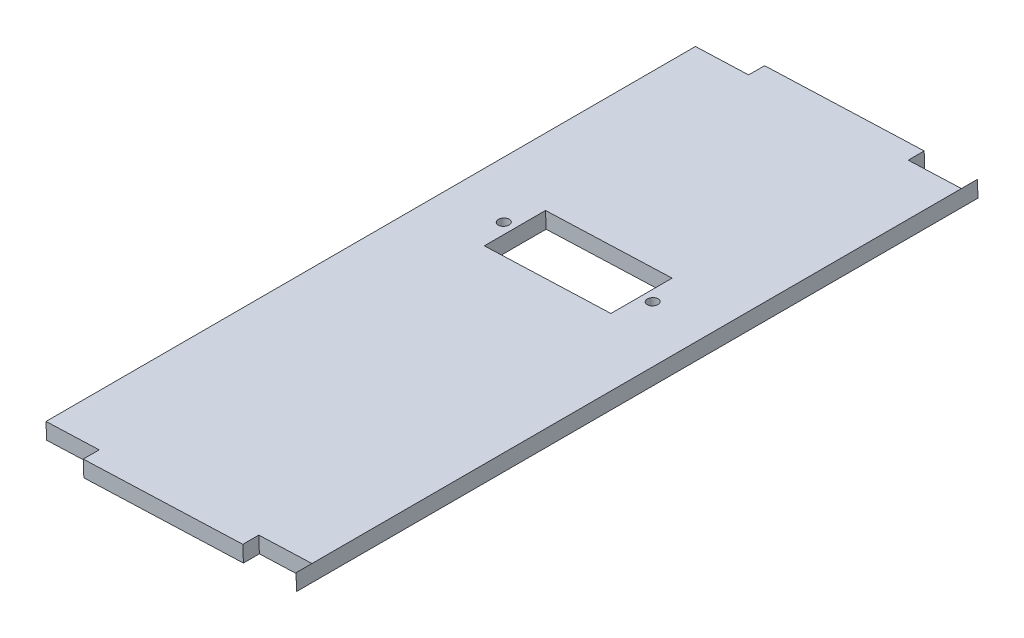
ISO-10303-21;
HEADER;
FILE_DESCRIPTION(('STEP AP214'),'2;1');
FILE_NAME('part.step','',(''),(''),'','','');
FILE_SCHEMA(('AUTOMOTIVE_DESIGN { 1 0 10303 214 1 1 1 1 }'));
ENDSEC;
DATA;
#1=APPLICATION_CONTEXT('core data for automotive mechanical design processes');
#2=APPLICATION_PROTOCOL_DEFINITION('international standard','automotive_design',2000,#1);
#3=PRODUCT_CONTEXT('',#1,'mechanical');
#4=PRODUCT('Part','Part','',(#3));
#5=PRODUCT_RELATED_PRODUCT_CATEGORY('part','',(#4));
#6=PRODUCT_DEFINITION_FORMATION('','',#4);
#7=PRODUCT_DEFINITION_CONTEXT('part definition',#1,'design');
#8=PRODUCT_DEFINITION('design','',#6,#7);
#9=PRODUCT_DEFINITION_SHAPE('','',#8);
#10=(LENGTH_UNIT() NAMED_UNIT(*) SI_UNIT(.MILLI.,.METRE.));
#11=(NAMED_UNIT(*) PLANE_ANGLE_UNIT() SI_UNIT($,.RADIAN.));
#12=(NAMED_UNIT(*) SI_UNIT($,.STERADIAN.) SOLID_ANGLE_UNIT());
#13=UNCERTAINTY_MEASURE_WITH_UNIT(LENGTH_MEASURE(1.E-05),#10,'distance_accuracy_value','');
#14=(GEOMETRIC_REPRESENTATION_CONTEXT(3) GLOBAL_UNCERTAINTY_ASSIGNED_CONTEXT((#13)) GLOBAL_UNIT_ASSIGNED_CONTEXT((#10,
#11,#12)) REPRESENTATION_CONTEXT('',''));
#15=CARTESIAN_POINT('',(0.,0.,0.));
#16=DIRECTION('',(0.,0.,1.));
#17=DIRECTION('',(1.,0.,0.));
#18=AXIS2_PLACEMENT_3D('',#15,#16,#17);
#19=CARTESIAN_POINT('',(0.,0.,890.01));
#20=DIRECTION('',(0.,0.,-1.));
#21=DIRECTION('',(-1.,0.,0.));
#22=AXIS2_PLACEMENT_3D('',#19,#20,#21);
#23=PLANE('',#22);
#24=DIRECTION('',(0.0396321778122835,-0.999214336607445,0.));
#25=VECTOR('',#24,1.);
#26=CARTESIAN_POINT('',(21.3702580239421,-5.63989004149993,890.01));
#27=LINE('',#26,#25);
#28=CARTESIAN_POINT('',(21.3702580239432,-5.63989004149989,890.01));
#29=VERTEX_POINT('',#28);
#30=CARTESIAN_POINT('',(21.4891545573789,-8.63753305132227,890.01));
#31=VERTEX_POINT('',#30);
#32=EDGE_CURVE('E254',#29,#31,#27,.T.);
#33=ORIENTED_EDGE('',*,*,#32,.F.);
#34=DIRECTION('',(0.0373407916957706,-0.999302589447027,0.));
#35=VECTOR('',#34,1.);
#36=CARTESIAN_POINT('',(21.1300096451221,0.789561937515577,890.01));
#37=LINE('',#36,#35);
#38=CARTESIAN_POINT('',(21.4822801045103,-8.63778992798335,890.01));
#39=VERTEX_POINT('',#38);
#40=EDGE_CURVE('E297',#29,#39,#37,.T.);
#41=ORIENTED_EDGE('',*,*,#40,.T.);
#42=DIRECTION('',(-0.999302589447027,-0.0373407916957706,0.));
#43=VECTOR('',#42,1.);
#44=CARTESIAN_POINT('',(21.4891545573789,-8.63753305132227,890.01));
#45=LINE('',#44,#43);
#46=EDGE_CURVE('E259',#31,#39,#45,.T.);
#47=ORIENTED_EDGE('',*,*,#46,.F.);
#48=EDGE_LOOP('',(#33,#41,#47));
#49=FACE_BOUND('',#48,.T.);
#50=ADVANCED_FACE('F41',(#49),#23,.F.);
#51=CARTESIAN_POINT('',(0.,0.,762.01));
#52=DIRECTION('',(0.,0.,-1.));
#53=DIRECTION('',(-1.,0.,0.));
#54=AXIS2_PLACEMENT_3D('',#51,#52,#53);
#55=PLANE('',#54);
#56=DIRECTION('',(0.0373407916957706,-0.999302589447027,0.));
#57=VECTOR('',#56,1.);
#58=CARTESIAN_POINT('',(21.130009645121,0.789561937515535,762.01));
#59=LINE('',#58,#57);
#60=CARTESIAN_POINT('',(21.3702580239421,-5.63989004149993,762.01));
#61=VERTEX_POINT('',#60);
#62=CARTESIAN_POINT('',(21.4822801045092,-8.63778992798339,762.01));
#63=VERTEX_POINT('',#62);
#64=EDGE_CURVE('E287',#61,#63,#59,.T.);
#65=ORIENTED_EDGE('',*,*,#64,.F.);
#66=DIRECTION('',(0.0396321778122835,-0.999214336607445,0.));
#67=VECTOR('',#66,1.);
#68=CARTESIAN_POINT('',(21.3702580239421,-5.63989004149993,762.01));
#69=LINE('',#68,#67);
#70=CARTESIAN_POINT('',(21.4891545573789,-8.63753305132227,762.01));
#71=VERTEX_POINT('',#70);
#72=EDGE_CURVE('E253',#61,#71,#69,.T.);
#73=ORIENTED_EDGE('',*,*,#72,.T.);
#74=DIRECTION('',(-0.999302589447027,-0.0373407916957706,0.));
#75=VECTOR('',#74,1.);
#76=CARTESIAN_POINT('',(21.4891545573789,-8.63753305132227,762.01));
#77=LINE('',#76,#75);
#78=EDGE_CURVE('E269',#71,#63,#77,.T.);
#79=ORIENTED_EDGE('',*,*,#78,.T.);
#80=EDGE_LOOP('',(#65,#73,#79));
#81=FACE_BOUND('',#80,.T.);
#82=ADVANCED_FACE('F401',(#81),#55,.T.);
#83=CARTESIAN_POINT('',(21.3702580239421,-5.63989004149993,890.01));
#84=DIRECTION('',(0.999214336607445,0.0396321778122835,0.));
#85=DIRECTION('',(-0.0396321778122835,0.999214336607445,0.));
#86=AXIS2_PLACEMENT_3D('',#83,#84,#85);
#87=PLANE('',#86);
#88=ORIENTED_EDGE('',*,*,#72,.F.);
#89=DIRECTION('',(0.,0.,-1.));
#90=VECTOR('',#89,1.);
#91=CARTESIAN_POINT('',(21.3702580239421,-5.63989004149993,762.01));
#92=LINE('',#91,#90);
#93=CARTESIAN_POINT('',(21.3702580239421,-5.63989004149993,765.01));
#94=VERTEX_POINT('',#93);
#95=EDGE_CURVE('E210',#94,#61,#92,.T.);
#96=ORIENTED_EDGE('',*,*,#95,.F.);
#97=DIRECTION('',(0.,0.,-1.));
#98=VECTOR('',#97,1.);
#99=CARTESIAN_POINT('',(21.3702580239421,-5.63989004149993,890.01));
#100=LINE('',#99,#98);
#101=CARTESIAN_POINT('',(21.3702580239432,-5.63989004149989,887.01));
#102=VERTEX_POINT('',#101);
#103=EDGE_CURVE('E278',#102,#94,#100,.T.);
#104=ORIENTED_EDGE('',*,*,#103,.F.);
#105=EDGE_CURVE('E274',#29,#102,#100,.T.);
#106=ORIENTED_EDGE('',*,*,#105,.F.);
#107=ORIENTED_EDGE('',*,*,#32,.T.);
#108=DIRECTION('',(0.,0.,-1.));
#109=VECTOR('',#108,1.);
#110=CARTESIAN_POINT('',(21.4891545573789,-8.63753305132227,890.01));
#111=LINE('',#110,#109);
#112=EDGE_CURVE('E265',#31,#71,#111,.T.);
#113=ORIENTED_EDGE('',*,*,#112,.T.);
#114=EDGE_LOOP('',(#88,#96,#104,#106,#107,#113));
#115=FACE_BOUND('',#114,.T.);
#116=ADVANCED_FACE('F43',(#115),#87,.T.);
#117=CARTESIAN_POINT('',(21.3702580239421,-5.63989004149993,890.01));
#118=DIRECTION('',(-0.0373407916957706,0.999302589447027,0.));
#119=DIRECTION('',(-0.999302589447027,-0.0373407916957706,0.));
#120=AXIS2_PLACEMENT_3D('',#117,#118,#119);
#121=PLANE('',#120);
#122=CARTESIAN_POINT('',(-17.602542964492,-7.09618091763499,812.01));
#123=DIRECTION('',(-0.0373407916957706,0.999302589447027,0.));
#124=DIRECTION('',(0.999302589447027,0.0373407916957706,0.));
#125=AXIS2_PLACEMENT_3D('',#122,#123,#124);
#126=CIRCLE('',#125,1.00000000000001);
#127=CARTESIAN_POINT('',(-16.6032403750449,-7.05884012593921,812.01));
#128=VERTEX_POINT('',#127);
#129=EDGE_CURVE('E460',#128,#128,#126,.T.);
#130=ORIENTED_EDGE('',*,*,#129,.F.);
#131=EDGE_LOOP('',(#130));
#132=FACE_BOUND('',#131,.T.);
#133=CARTESIAN_POINT('',(10.3779295400248,-6.05063875015341,812.01));
#134=DIRECTION('',(-0.0373407916957706,0.999302589447027,0.));
#135=DIRECTION('',(-0.999302589447027,-0.0373407916957706,0.));
#136=AXIS2_PLACEMENT_3D('',#133,#134,#135);
#137=CIRCLE('',#136,1.);
#138=CARTESIAN_POINT('',(9.37862695057775,-6.08797954184918,812.01));
#139=VERTEX_POINT('',#138);
#140=EDGE_CURVE('E458',#139,#139,#137,.T.);
#141=ORIENTED_EDGE('',*,*,#140,.F.);
#142=EDGE_LOOP('',(#141));
#143=FACE_BOUND('',#142,.T.);
#144=DIRECTION('',(0.,0.,-1.));
#145=VECTOR('',#144,1.);
#146=CARTESIAN_POINT('',(8.27939410218603,-6.12905441271453,806.26));
#147=LINE('',#146,#145);
#148=CARTESIAN_POINT('',(8.27939410218603,-6.12905441271453,817.76));
#149=VERTEX_POINT('',#148);
#150=CARTESIAN_POINT('',(8.27939410218601,-6.12905441271453,806.26));
#151=VERTEX_POINT('',#150);
#152=EDGE_CURVE('E58',#149,#151,#147,.T.);
#153=ORIENTED_EDGE('',*,*,#152,.F.);
#154=DIRECTION('',(0.999302589447027,0.0373407916957706,0.));
#155=VECTOR('',#154,1.);
#156=CARTESIAN_POINT('',(-15.5040075266532,-7.01776525507387,817.76));
#157=LINE('',#156,#155);
#158=CARTESIAN_POINT('',(-15.5040075266532,-7.01776525507387,817.76));
#159=VERTEX_POINT('',#158);
#160=EDGE_CURVE('E192',#159,#149,#157,.T.);
#161=ORIENTED_EDGE('',*,*,#160,.F.);
#162=DIRECTION('',(0.,0.,1.));
#163=VECTOR('',#162,1.);
#164=CARTESIAN_POINT('',(-15.5040075266532,-7.01776525507387,806.26));
#165=LINE('',#164,#163);
#166=CARTESIAN_POINT('',(-15.5040075266532,-7.01776525507387,806.26));
#167=VERTEX_POINT('',#166);
#168=EDGE_CURVE('E176',#167,#159,#165,.T.);
#169=ORIENTED_EDGE('',*,*,#168,.F.);
#170=DIRECTION('',(-0.999302589447027,-0.0373407916957706,0.));
#171=VECTOR('',#170,1.);
#172=CARTESIAN_POINT('',(-15.5040075266532,-7.01776525507387,806.26));
#173=LINE('',#172,#171);
#174=EDGE_CURVE('E185',#151,#167,#173,.T.);
#175=ORIENTED_EDGE('',*,*,#174,.F.);
#176=EDGE_LOOP('',(#153,#161,#169,#175));
#177=FACE_BOUND('',#176,.T.);
#178=DIRECTION('',(0.,0.,1.));
#179=VECTOR('',#178,1.);
#180=CARTESIAN_POINT('',(11.3772058565452,-6.01329894019419,887.01));
#181=LINE('',#180,#179);
#182=CARTESIAN_POINT('',(11.3772058565452,-6.01329894019419,887.01));
#183=VERTEX_POINT('',#182);
#184=CARTESIAN_POINT('',(11.3772058565452,-6.01329894019419,890.01));
#185=VERTEX_POINT('',#184);
#186=EDGE_CURVE('E220',#183,#185,#181,.T.);
#187=ORIENTED_EDGE('',*,*,#186,.F.);
#188=DIRECTION('',(-0.999302589447027,-0.0373407916957706,0.));
#189=VECTOR('',#188,1.);
#190=CARTESIAN_POINT('',(21.3702580239432,-5.63989004149989,887.01));
#191=LINE('',#190,#189);
#192=EDGE_CURVE('E214',#102,#183,#191,.T.);
#193=ORIENTED_EDGE('',*,*,#192,.F.);
#194=ORIENTED_EDGE('',*,*,#103,.T.);
#195=DIRECTION('',(0.999302589447027,0.0373407916957706,0.));
#196=VECTOR('',#195,1.);
#197=CARTESIAN_POINT('',(21.3702580239421,-5.63989004149993,765.01));
#198=LINE('',#197,#196);
#199=CARTESIAN_POINT('',(11.3772058565441,-6.01329894019423,765.01));
#200=VERTEX_POINT('',#199);
#201=EDGE_CURVE('E230',#200,#94,#198,.T.);
#202=ORIENTED_EDGE('',*,*,#201,.F.);
#203=DIRECTION('',(0.,0.,1.));
#204=VECTOR('',#203,1.);
#205=CARTESIAN_POINT('',(11.3772058565441,-6.01329894019423,762.01));
#206=LINE('',#205,#204);
#207=CARTESIAN_POINT('',(11.3772058565441,-6.01329894019423,762.01));
#208=VERTEX_POINT('',#207);
#209=EDGE_CURVE('E227',#208,#200,#206,.T.);
#210=ORIENTED_EDGE('',*,*,#209,.F.);
#211=DIRECTION('',(0.999302589447027,0.0373407916957706,0.));
#212=VECTOR('',#211,1.);
#213=CARTESIAN_POINT('',(21.3702580239421,-5.63989004149993,762.01));
#214=LINE('',#213,#212);
#215=CARTESIAN_POINT('',(-18.601845553939,-7.13352170933075,762.01));
#216=VERTEX_POINT('',#215);
#217=EDGE_CURVE('E258',#216,#208,#214,.T.);
#218=ORIENTED_EDGE('',*,*,#217,.F.);
#219=DIRECTION('',(0.,0.,-1.));
#220=VECTOR('',#219,1.);
#221=CARTESIAN_POINT('',(-18.601845553939,-7.13352170933076,762.01));
#222=LINE('',#221,#220);
#223=CARTESIAN_POINT('',(-18.601845553939,-7.13352170933076,765.01));
#224=VERTEX_POINT('',#223);
#225=EDGE_CURVE('E208',#224,#216,#222,.T.);
#226=ORIENTED_EDGE('',*,*,#225,.F.);
#227=DIRECTION('',(0.999302589447027,0.0373407916957707,0.));
#228=VECTOR('',#227,1.);
#229=CARTESIAN_POINT('',(-18.601845553939,-7.13352170933076,765.01));
#230=LINE('',#229,#228);
#231=CARTESIAN_POINT('',(-28.5948714484093,-7.50692962628846,765.01));
#232=VERTEX_POINT('',#231);
#233=EDGE_CURVE('E204',#232,#224,#230,.T.);
#234=ORIENTED_EDGE('',*,*,#233,.F.);
#235=DIRECTION('',(0.,0.,-1.));
#236=VECTOR('',#235,1.);
#237=CARTESIAN_POINT('',(-28.5948714484093,-7.50692962628846,890.01));
#238=LINE('',#237,#236);
#239=CARTESIAN_POINT('',(-28.5948714484093,-7.50692962628846,887.01));
#240=VERTEX_POINT('',#239);
#241=EDGE_CURVE('E279',#240,#232,#238,.T.);
#242=ORIENTED_EDGE('',*,*,#241,.F.);
#243=DIRECTION('',(-0.999302589447027,-0.0373407916957707,0.));
#244=VECTOR('',#243,1.);
#245=CARTESIAN_POINT('',(-18.6018455539379,-7.13352170933071,887.01));
#246=LINE('',#245,#244);
#247=CARTESIAN_POINT('',(-18.6018455539379,-7.13352170933071,887.01));
#248=VERTEX_POINT('',#247);
#249=EDGE_CURVE('E213',#248,#240,#246,.T.);
#250=ORIENTED_EDGE('',*,*,#249,.F.);
#251=DIRECTION('',(0.,0.,-1.));
#252=VECTOR('',#251,1.);
#253=CARTESIAN_POINT('',(-18.6018455539379,-7.13352170933071,887.01));
#254=LINE('',#253,#252);
#255=CARTESIAN_POINT('',(-18.6018455539379,-7.13352170933071,890.01));
#256=VERTEX_POINT('',#255);
#257=EDGE_CURVE('E205',#256,#248,#254,.T.);
#258=ORIENTED_EDGE('',*,*,#257,.F.);
#259=DIRECTION('',(0.999302589447027,0.0373407916957706,0.));
#260=VECTOR('',#259,1.);
#261=CARTESIAN_POINT('',(21.3702580239421,-5.63989004149993,890.01));
#262=LINE('',#261,#260);
#263=EDGE_CURVE('E262',#256,#185,#262,.T.);
#264=ORIENTED_EDGE('',*,*,#263,.T.);
#265=EDGE_LOOP('',(#187,#193,#194,#202,#210,#218,#226,#234,#242,#250,#258,#264));
#266=FACE_BOUND('',#265,.T.);
#267=ADVANCED_FACE('F189',(#132,#143,#177,#266),#121,.T.);
#268=CARTESIAN_POINT('',(-28.5948714484093,-7.50692962628846,890.01));
#269=DIRECTION('',(-0.999214336607445,-0.0396321778122847,0.));
#270=DIRECTION('',(0.0396321778122847,-0.999214336607445,0.));
#271=AXIS2_PLACEMENT_3D('',#268,#269,#270);
#272=PLANE('',#271);
#273=DIRECTION('',(0.0396321778122847,-0.999214336607445,0.));
#274=VECTOR('',#273,1.);
#275=CARTESIAN_POINT('',(-28.5948714484093,-7.50692962628846,887.01));
#276=LINE('',#275,#274);
#277=CARTESIAN_POINT('',(-28.4759749149724,-10.5045726361108,887.01));
#278=VERTEX_POINT('',#277);
#279=EDGE_CURVE('E251',#240,#278,#276,.T.);
#280=ORIENTED_EDGE('',*,*,#279,.F.);
#281=ORIENTED_EDGE('',*,*,#241,.T.);
#282=DIRECTION('',(-0.0396321778122847,0.999214336607445,0.));
#283=VECTOR('',#282,1.);
#284=CARTESIAN_POINT('',(-28.5948714484093,-7.50692962628846,765.01));
#285=LINE('',#284,#283);
#286=CARTESIAN_POINT('',(-28.4759749149724,-10.5045726361108,765.01));
#287=VERTEX_POINT('',#286);
#288=EDGE_CURVE('E249',#287,#232,#285,.T.);
#289=ORIENTED_EDGE('',*,*,#288,.F.);
#290=DIRECTION('',(0.,0.,-1.));
#291=VECTOR('',#290,1.);
#292=CARTESIAN_POINT('',(-28.4759749149724,-10.5045726361108,890.01));
#293=LINE('',#292,#291);
#294=EDGE_CURVE('E282',#278,#287,#293,.T.);
#295=ORIENTED_EDGE('',*,*,#294,.F.);
#296=EDGE_LOOP('',(#280,#281,#289,#295));
#297=FACE_BOUND('',#296,.T.);
#298=ADVANCED_FACE('F324',(#297),#272,.T.);
#299=CARTESIAN_POINT('',(21.4891545573789,-8.63753305132227,890.01));
#300=DIRECTION('',(0.0373407916957706,-0.999302589447027,0.));
#301=DIRECTION('',(0.999302589447027,0.0373407916957706,0.));
#302=AXIS2_PLACEMENT_3D('',#299,#300,#301);
#303=PLANE('',#302);
#304=CARTESIAN_POINT('',(-17.4905208839249,-10.0940808041184,812.01));
#305=DIRECTION('',(0.0373407916957706,-0.999302589447027,0.));
#306=DIRECTION('',(0.999302589447027,0.0373407916957706,0.));
#307=AXIS2_PLACEMENT_3D('',#304,#305,#306);
#308=CIRCLE('',#307,1.00000000000001);
#309=CARTESIAN_POINT('',(-16.4912182944778,-10.0567400124227,812.01));
#310=VERTEX_POINT('',#309);
#311=EDGE_CURVE('E45',#310,#310,#308,.T.);
#312=ORIENTED_EDGE('',*,*,#311,.F.);
#313=EDGE_LOOP('',(#312));
#314=FACE_BOUND('',#313,.T.);
#315=CARTESIAN_POINT('',(10.4899516205919,-9.04853863663687,812.01));
#316=DIRECTION('',(0.0373407916957706,-0.999302589447027,0.));
#317=DIRECTION('',(0.999302589447027,0.0373407916957706,0.));
#318=AXIS2_PLACEMENT_3D('',#315,#316,#317);
#319=CIRCLE('',#318,1.);
#320=CARTESIAN_POINT('',(11.4892542100389,-9.0111978449411,812.01));
#321=VERTEX_POINT('',#320);
#322=EDGE_CURVE('E199',#321,#321,#319,.T.);
#323=ORIENTED_EDGE('',*,*,#322,.F.);
#324=EDGE_LOOP('',(#323));
#325=FACE_BOUND('',#324,.T.);
#326=DIRECTION('',(0.,0.,1.));
#327=VECTOR('',#326,1.);
#328=CARTESIAN_POINT('',(8.39141618275315,-9.12695429919799,890.01));
#329=LINE('',#328,#327);
#330=CARTESIAN_POINT('',(8.39141618275313,-9.12695429919799,806.26));
#331=VERTEX_POINT('',#330);
#332=CARTESIAN_POINT('',(8.39141618275313,-9.12695429919799,817.76));
#333=VERTEX_POINT('',#332);
#334=EDGE_CURVE('E11',#331,#333,#329,.T.);
#335=ORIENTED_EDGE('',*,*,#334,.F.);
#336=DIRECTION('',(0.999302589447027,0.0373407916957706,0.));
#337=VECTOR('',#336,1.);
#338=CARTESIAN_POINT('',(21.4891545573789,-8.63753305132227,806.26));
#339=LINE('',#338,#337);
#340=CARTESIAN_POINT('',(-15.3919854460861,-10.0156651415573,806.26));
#341=VERTEX_POINT('',#340);
#342=EDGE_CURVE('E308',#341,#331,#339,.T.);
#343=ORIENTED_EDGE('',*,*,#342,.F.);
#344=DIRECTION('',(0.,0.,-1.));
#345=VECTOR('',#344,1.);
#346=CARTESIAN_POINT('',(-15.3919854460861,-10.0156651415573,890.01));
#347=LINE('',#346,#345);
#348=CARTESIAN_POINT('',(-15.3919854460861,-10.0156651415573,817.76));
#349=VERTEX_POINT('',#348);
#350=EDGE_CURVE('E179',#349,#341,#347,.T.);
#351=ORIENTED_EDGE('',*,*,#350,.F.);
#352=DIRECTION('',(-0.999302589447027,-0.0373407916957706,0.));
#353=VECTOR('',#352,1.);
#354=CARTESIAN_POINT('',(21.4891545573789,-8.63753305132227,817.76));
#355=LINE('',#354,#353);
#356=EDGE_CURVE('E50',#333,#349,#355,.T.);
#357=ORIENTED_EDGE('',*,*,#356,.F.);
#358=EDGE_LOOP('',(#335,#343,#351,#357));
#359=FACE_BOUND('',#358,.T.);
#360=DIRECTION('',(0.,0.,1.));
#361=VECTOR('',#360,1.);
#362=CARTESIAN_POINT('',(21.4822801045103,-8.63778992798335,890.01));
#363=LINE('',#362,#361);
#364=CARTESIAN_POINT('',(21.4822801045103,-8.63778992798335,887.01));
#365=VERTEX_POINT('',#364);
#366=EDGE_CURVE('E247',#365,#39,#363,.T.);
#367=ORIENTED_EDGE('',*,*,#366,.F.);
#368=DIRECTION('',(0.999302589447027,0.0373407916957706,0.));
#369=VECTOR('',#368,1.);
#370=CARTESIAN_POINT('',(21.4891545573789,-8.63753305132227,887.01));
#371=LINE('',#370,#369);
#372=CARTESIAN_POINT('',(11.4892279371123,-9.01119882667765,887.01));
#373=VERTEX_POINT('',#372);
#374=EDGE_CURVE('E306',#373,#365,#371,.T.);
#375=ORIENTED_EDGE('',*,*,#374,.F.);
#376=DIRECTION('',(0.,0.,-1.));
#377=VECTOR('',#376,1.);
#378=CARTESIAN_POINT('',(11.4892279371123,-9.01119882667765,890.01));
#379=LINE('',#378,#377);
#380=CARTESIAN_POINT('',(11.4892279371123,-9.01119882667765,890.01));
#381=VERTEX_POINT('',#380);
#382=EDGE_CURVE('E245',#381,#373,#379,.T.);
#383=ORIENTED_EDGE('',*,*,#382,.F.);
#384=CARTESIAN_POINT('',(-18.4898234733708,-10.1314215958142,890.01));
#385=VERTEX_POINT('',#384);
#386=EDGE_CURVE('E257',#381,#385,#45,.T.);
#387=ORIENTED_EDGE('',*,*,#386,.T.);
#388=DIRECTION('',(0.,0.,1.));
#389=VECTOR('',#388,1.);
#390=CARTESIAN_POINT('',(-18.4898234733708,-10.1314215958142,890.01));
#391=LINE('',#390,#389);
#392=CARTESIAN_POINT('',(-18.4898234733708,-10.1314215958142,887.01));
#393=VERTEX_POINT('',#392);
#394=EDGE_CURVE('E243',#393,#385,#391,.T.);
#395=ORIENTED_EDGE('',*,*,#394,.F.);
#396=DIRECTION('',(0.999302589447027,0.0373407916957706,0.));
#397=VECTOR('',#396,1.);
#398=CARTESIAN_POINT('',(21.4891545573789,-8.63753305132227,887.01));
#399=LINE('',#398,#397);
#400=EDGE_CURVE('E304',#278,#393,#399,.T.);
#401=ORIENTED_EDGE('',*,*,#400,.F.);
#402=ORIENTED_EDGE('',*,*,#294,.T.);
#403=DIRECTION('',(-0.999302589447027,-0.0373407916957706,0.));
#404=VECTOR('',#403,1.);
#405=CARTESIAN_POINT('',(21.4891545573789,-8.63753305132227,765.01));
#406=LINE('',#405,#404);
#407=CARTESIAN_POINT('',(-18.4898234733719,-10.1314215958142,765.01));
#408=VERTEX_POINT('',#407);
#409=EDGE_CURVE('E302',#408,#287,#406,.T.);
#410=ORIENTED_EDGE('',*,*,#409,.F.);
#411=DIRECTION('',(0.,0.,1.));
#412=VECTOR('',#411,1.);
#413=CARTESIAN_POINT('',(-18.4898234733719,-10.1314215958142,890.01));
#414=LINE('',#413,#412);
#415=CARTESIAN_POINT('',(-18.4898234733719,-10.1314215958142,762.01));
#416=VERTEX_POINT('',#415);
#417=EDGE_CURVE('E241',#416,#408,#414,.T.);
#418=ORIENTED_EDGE('',*,*,#417,.F.);
#419=CARTESIAN_POINT('',(11.4892279371112,-9.01119882667769,762.01));
#420=VERTEX_POINT('',#419);
#421=EDGE_CURVE('E268',#420,#416,#77,.T.);
#422=ORIENTED_EDGE('',*,*,#421,.F.);
#423=DIRECTION('',(0.,0.,-1.));
#424=VECTOR('',#423,1.);
#425=CARTESIAN_POINT('',(11.4892279371112,-9.01119882667769,890.01));
#426=LINE('',#425,#424);
#427=CARTESIAN_POINT('',(11.4892279371112,-9.01119882667769,765.01));
#428=VERTEX_POINT('',#427);
#429=EDGE_CURVE('E236',#428,#420,#426,.T.);
#430=ORIENTED_EDGE('',*,*,#429,.F.);
#431=DIRECTION('',(-0.999302589447027,-0.0373407916957706,0.));
#432=VECTOR('',#431,1.);
#433=CARTESIAN_POINT('',(21.4891545573789,-8.63753305132227,765.01));
#434=LINE('',#433,#432);
#435=CARTESIAN_POINT('',(21.4822801045092,-8.63778992798339,765.01));
#436=VERTEX_POINT('',#435);
#437=EDGE_CURVE('E300',#436,#428,#434,.T.);
#438=ORIENTED_EDGE('',*,*,#437,.F.);
#439=DIRECTION('',(0.,0.,1.));
#440=VECTOR('',#439,1.);
#441=CARTESIAN_POINT('',(21.4822801045092,-8.63778992798339,890.01));
#442=LINE('',#441,#440);
#443=EDGE_CURVE('E239',#63,#436,#442,.T.);
#444=ORIENTED_EDGE('',*,*,#443,.F.);
#445=ORIENTED_EDGE('',*,*,#78,.F.);
#446=ORIENTED_EDGE('',*,*,#112,.F.);
#447=ORIENTED_EDGE('',*,*,#46,.T.);
#448=EDGE_LOOP('',(#367,#375,#383,#387,#395,#401,#402,#410,#418,#422,#430,#438,#444,#445,#446,#447));
#449=FACE_BOUND('',#448,.T.);
#450=ADVANCED_FACE('F320',(#314,#325,#359,#449),#303,.T.);
#451=ORIENTED_EDGE('',*,*,#386,.F.);
#452=DIRECTION('',(-0.0373407916957706,0.999302589447027,0.));
#453=VECTOR('',#452,1.);
#454=CARTESIAN_POINT('',(11.1369574777241,0.416153038821275,890.01));
#455=LINE('',#454,#453);
#456=EDGE_CURVE('E294',#381,#185,#455,.T.);
#457=ORIENTED_EDGE('',*,*,#456,.T.);
#458=ORIENTED_EDGE('',*,*,#263,.F.);
#459=DIRECTION('',(0.0373407916957706,-0.999302589447027,0.));
#460=VECTOR('',#459,1.);
#461=CARTESIAN_POINT('',(-18.842093932759,-0.704069730315247,890.01));
#462=LINE('',#461,#460);
#463=EDGE_CURVE('E291',#256,#385,#462,.T.);
#464=ORIENTED_EDGE('',*,*,#463,.T.);
#465=EDGE_LOOP('',(#451,#457,#458,#464));
#466=FACE_BOUND('',#465,.T.);
#467=ADVANCED_FACE('F323',(#466),#23,.F.);
#468=DIRECTION('',(0.0373407916957706,-0.999302589447027,0.));
#469=VECTOR('',#468,1.);
#470=CARTESIAN_POINT('',(-18.8420939327601,-0.704069730315288,762.01));
#471=LINE('',#470,#469);
#472=EDGE_CURVE('E289',#216,#416,#471,.T.);
#473=ORIENTED_EDGE('',*,*,#472,.F.);
#474=ORIENTED_EDGE('',*,*,#217,.T.);
#475=DIRECTION('',(-0.0373407916957706,0.999302589447027,0.));
#476=VECTOR('',#475,1.);
#477=CARTESIAN_POINT('',(11.136957477723,0.416153038821233,762.01));
#478=LINE('',#477,#476);
#479=EDGE_CURVE('E277',#420,#208,#478,.T.);
#480=ORIENTED_EDGE('',*,*,#479,.F.);
#481=ORIENTED_EDGE('',*,*,#421,.T.);
#482=EDGE_LOOP('',(#473,#474,#480,#481));
#483=FACE_BOUND('',#482,.T.);
#484=ADVANCED_FACE('F385',(#483),#55,.T.);
#485=CARTESIAN_POINT('',(21.551948219545,-10.5022262346469,762.01));
#486=DIRECTION('',(0.999302589447027,0.0373407916957706,0.));
#487=DIRECTION('',(-0.0373407916957706,0.999302589447027,0.));
#488=AXIS2_PLACEMENT_3D('',#485,#486,#487);
#489=PLANE('',#488);
#490=ORIENTED_EDGE('',*,*,#443,.T.);
#491=DIRECTION('',(-0.0373407916957706,0.999302589447027,0.));
#492=VECTOR('',#491,1.);
#493=CARTESIAN_POINT('',(21.551948219545,-10.5022262346469,765.01));
#494=LINE('',#493,#492);
#495=EDGE_CURVE('E234',#436,#94,#494,.T.);
#496=ORIENTED_EDGE('',*,*,#495,.T.);
#497=ORIENTED_EDGE('',*,*,#95,.T.);
#498=ORIENTED_EDGE('',*,*,#64,.T.);
#499=EDGE_LOOP('',(#490,#496,#497,#498));
#500=FACE_BOUND('',#499,.T.);
#501=ADVANCED_FACE('F398',(#500),#489,.F.);
#502=CARTESIAN_POINT('',(21.551948219545,-10.5022262346469,765.01));
#503=DIRECTION('',(0.,0.,1.));
#504=DIRECTION('',(1.,0.,0.));
#505=AXIS2_PLACEMENT_3D('',#502,#503,#504);
#506=PLANE('',#505);
#507=ORIENTED_EDGE('',*,*,#437,.T.);
#508=DIRECTION('',(-0.0373407916957706,0.999302589447027,0.));
#509=VECTOR('',#508,1.);
#510=CARTESIAN_POINT('',(11.5588960521469,-10.8756351333412,765.01));
#511=LINE('',#510,#509);
#512=EDGE_CURVE('E233',#428,#200,#511,.T.);
#513=ORIENTED_EDGE('',*,*,#512,.T.);
#514=ORIENTED_EDGE('',*,*,#201,.T.);
#515=ORIENTED_EDGE('',*,*,#495,.F.);
#516=EDGE_LOOP('',(#507,#513,#514,#515));
#517=FACE_BOUND('',#516,.T.);
#518=ADVANCED_FACE('F396',(#517),#506,.F.);
#519=CARTESIAN_POINT('',(11.5588960521469,-10.8756351333412,762.01));
#520=DIRECTION('',(-0.999302589447027,-0.0373407916957706,0.));
#521=DIRECTION('',(0.0373407916957706,-0.999302589447027,0.));
#522=AXIS2_PLACEMENT_3D('',#519,#520,#521);
#523=PLANE('',#522);
#524=ORIENTED_EDGE('',*,*,#429,.T.);
#525=ORIENTED_EDGE('',*,*,#479,.T.);
#526=ORIENTED_EDGE('',*,*,#209,.T.);
#527=ORIENTED_EDGE('',*,*,#512,.F.);
#528=EDGE_LOOP('',(#524,#525,#526,#527));
#529=FACE_BOUND('',#528,.T.);
#530=ADVANCED_FACE('F390',(#529),#523,.F.);
#531=CARTESIAN_POINT('',(-18.4201553583361,-11.9958579024777,762.01));
#532=DIRECTION('',(0.999302589447027,0.0373407916957706,0.));
#533=DIRECTION('',(-0.0373407916957706,0.999302589447027,0.));
#534=AXIS2_PLACEMENT_3D('',#531,#532,#533);
#535=PLANE('',#534);
#536=ORIENTED_EDGE('',*,*,#417,.T.);
#537=DIRECTION('',(-0.0373407916957706,0.999302589447027,0.));
#538=VECTOR('',#537,1.);
#539=CARTESIAN_POINT('',(-18.4201553583361,-11.9958579024777,765.01));
#540=LINE('',#539,#538);
#541=EDGE_CURVE('E202',#408,#224,#540,.T.);
#542=ORIENTED_EDGE('',*,*,#541,.T.);
#543=ORIENTED_EDGE('',*,*,#225,.T.);
#544=ORIENTED_EDGE('',*,*,#472,.T.);
#545=EDGE_LOOP('',(#536,#542,#543,#544));
#546=FACE_BOUND('',#545,.T.);
#547=ADVANCED_FACE('F381',(#546),#535,.F.);
#548=CARTESIAN_POINT('',(-18.4201553583361,-11.9958579024777,765.01));
#549=DIRECTION('',(0.,0.,1.));
#550=DIRECTION('',(1.,0.,0.));
#551=AXIS2_PLACEMENT_3D('',#548,#549,#550);
#552=PLANE('',#551);
#553=ORIENTED_EDGE('',*,*,#288,.T.);
#554=ORIENTED_EDGE('',*,*,#233,.T.);
#555=ORIENTED_EDGE('',*,*,#541,.F.);
#556=ORIENTED_EDGE('',*,*,#409,.T.);
#557=EDGE_LOOP('',(#553,#554,#555,#556));
#558=FACE_BOUND('',#557,.T.);
#559=ADVANCED_FACE('F378',(#558),#552,.F.);
#560=CARTESIAN_POINT('',(-18.420155358335,-11.9958579024777,887.01));
#561=DIRECTION('',(0.999302589447027,0.0373407916957706,0.));
#562=DIRECTION('',(-0.0373407916957706,0.999302589447027,0.));
#563=AXIS2_PLACEMENT_3D('',#560,#561,#562);
#564=PLANE('',#563);
#565=ORIENTED_EDGE('',*,*,#394,.T.);
#566=ORIENTED_EDGE('',*,*,#463,.F.);
#567=ORIENTED_EDGE('',*,*,#257,.T.);
#568=DIRECTION('',(-0.0373407916957706,0.999302589447027,0.));
#569=VECTOR('',#568,1.);
#570=CARTESIAN_POINT('',(-18.420155358335,-11.9958579024777,887.01));
#571=LINE('',#570,#569);
#572=EDGE_CURVE('E211',#393,#248,#571,.T.);
#573=ORIENTED_EDGE('',*,*,#572,.F.);
#574=EDGE_LOOP('',(#565,#566,#567,#573));
#575=FACE_BOUND('',#574,.T.);
#576=ADVANCED_FACE('F360',(#575),#564,.F.);
#577=CARTESIAN_POINT('',(-18.420155358335,-11.9958579024777,887.01));
#578=DIRECTION('',(0.,0.,-1.));
#579=DIRECTION('',(-1.,0.,0.));
#580=AXIS2_PLACEMENT_3D('',#577,#578,#579);
#581=PLANE('',#580);
#582=ORIENTED_EDGE('',*,*,#279,.T.);
#583=ORIENTED_EDGE('',*,*,#400,.T.);
#584=ORIENTED_EDGE('',*,*,#572,.T.);
#585=ORIENTED_EDGE('',*,*,#249,.T.);
#586=EDGE_LOOP('',(#582,#583,#584,#585));
#587=FACE_BOUND('',#586,.T.);
#588=ADVANCED_FACE('F367',(#587),#581,.F.);
#589=CARTESIAN_POINT('',(21.5519482195461,-10.5022262346469,887.01));
#590=DIRECTION('',(0.999302589447027,0.0373407916957706,0.));
#591=DIRECTION('',(-0.0373407916957706,0.999302589447027,0.));
#592=AXIS2_PLACEMENT_3D('',#589,#590,#591);
#593=PLANE('',#592);
#594=ORIENTED_EDGE('',*,*,#366,.T.);
#595=ORIENTED_EDGE('',*,*,#40,.F.);
#596=ORIENTED_EDGE('',*,*,#105,.T.);
#597=DIRECTION('',(-0.0373407916957706,0.999302589447027,0.));
#598=VECTOR('',#597,1.);
#599=CARTESIAN_POINT('',(21.5519482195461,-10.5022262346469,887.01));
#600=LINE('',#599,#598);
#601=EDGE_CURVE('E218',#365,#102,#600,.T.);
#602=ORIENTED_EDGE('',*,*,#601,.F.);
#603=EDGE_LOOP('',(#594,#595,#596,#602));
#604=FACE_BOUND('',#603,.T.);
#605=ADVANCED_FACE('F335',(#604),#593,.F.);
#606=CARTESIAN_POINT('',(11.5588960521481,-10.8756351333412,887.01));
#607=DIRECTION('',(-0.999302589447027,-0.0373407916957706,0.));
#608=DIRECTION('',(0.0373407916957706,-0.999302589447027,0.));
#609=AXIS2_PLACEMENT_3D('',#606,#607,#608);
#610=PLANE('',#609);
#611=ORIENTED_EDGE('',*,*,#382,.T.);
#612=DIRECTION('',(-0.0373407916957706,0.999302589447027,0.));
#613=VECTOR('',#612,1.);
#614=CARTESIAN_POINT('',(11.5588960521481,-10.8756351333412,887.01));
#615=LINE('',#614,#613);
#616=EDGE_CURVE('E221',#373,#183,#615,.T.);
#617=ORIENTED_EDGE('',*,*,#616,.T.);
#618=ORIENTED_EDGE('',*,*,#186,.T.);
#619=ORIENTED_EDGE('',*,*,#456,.F.);
#620=EDGE_LOOP('',(#611,#617,#618,#619));
#621=FACE_BOUND('',#620,.T.);
#622=ADVANCED_FACE('F352',(#621),#610,.F.);
#623=CARTESIAN_POINT('',(21.5519482195461,-10.5022262346469,887.01));
#624=DIRECTION('',(0.,0.,-1.));
#625=DIRECTION('',(-1.,0.,0.));
#626=AXIS2_PLACEMENT_3D('',#623,#624,#625);
#627=PLANE('',#626);
#628=ORIENTED_EDGE('',*,*,#374,.T.);
#629=ORIENTED_EDGE('',*,*,#601,.T.);
#630=ORIENTED_EDGE('',*,*,#192,.T.);
#631=ORIENTED_EDGE('',*,*,#616,.F.);
#632=EDGE_LOOP('',(#628,#629,#630,#631));
#633=FACE_BOUND('',#632,.T.);
#634=ADVANCED_FACE('F350',(#633),#627,.F.);
#635=CARTESIAN_POINT('',(8.46108429778892,-10.9913906058615,806.26));
#636=DIRECTION('',(0.999302589447027,0.0373407916957706,0.));
#637=DIRECTION('',(-0.0373407916957706,0.999302589447027,0.));
#638=AXIS2_PLACEMENT_3D('',#635,#636,#637);
#639=PLANE('',#638);
#640=ORIENTED_EDGE('',*,*,#334,.T.);
#641=DIRECTION('',(-0.0373407916957706,0.999302589447027,0.));
#642=VECTOR('',#641,1.);
#643=CARTESIAN_POINT('',(8.46108429778892,-10.9913906058615,817.76));
#644=LINE('',#643,#642);
#645=EDGE_CURVE('E197',#333,#149,#644,.T.);
#646=ORIENTED_EDGE('',*,*,#645,.T.);
#647=ORIENTED_EDGE('',*,*,#152,.T.);
#648=DIRECTION('',(-0.0373407916957706,0.999302589447027,0.));
#649=VECTOR('',#648,1.);
#650=CARTESIAN_POINT('',(8.46108429778892,-10.9913906058615,806.26));
#651=LINE('',#650,#649);
#652=EDGE_CURVE('E182',#331,#151,#651,.T.);
#653=ORIENTED_EDGE('',*,*,#652,.F.);
#654=EDGE_LOOP('',(#640,#646,#647,#653));
#655=FACE_BOUND('',#654,.T.);
#656=ADVANCED_FACE('F428',(#655),#639,.F.);
#657=CARTESIAN_POINT('',(-15.3223173310503,-11.8801014482208,817.76));
#658=DIRECTION('',(0.,0.,1.));
#659=DIRECTION('',(1.,0.,0.));
#660=AXIS2_PLACEMENT_3D('',#657,#658,#659);
#661=PLANE('',#660);
#662=ORIENTED_EDGE('',*,*,#356,.T.);
#663=DIRECTION('',(-0.0373407916957706,0.999302589447027,0.));
#664=VECTOR('',#663,1.);
#665=CARTESIAN_POINT('',(-15.3223173310503,-11.8801014482208,817.76));
#666=LINE('',#665,#664);
#667=EDGE_CURVE('E181',#349,#159,#666,.T.);
#668=ORIENTED_EDGE('',*,*,#667,.T.);
#669=ORIENTED_EDGE('',*,*,#160,.T.);
#670=ORIENTED_EDGE('',*,*,#645,.F.);
#671=EDGE_LOOP('',(#662,#668,#669,#670));
#672=FACE_BOUND('',#671,.T.);
#673=ADVANCED_FACE('F441',(#672),#661,.F.);
#674=CARTESIAN_POINT('',(-15.3223173310503,-11.8801014482208,806.26));
#675=DIRECTION('',(-0.999302589447027,-0.0373407916957706,0.));
#676=DIRECTION('',(0.0373407916957706,-0.999302589447027,0.));
#677=AXIS2_PLACEMENT_3D('',#674,#675,#676);
#678=PLANE('',#677);
#679=ORIENTED_EDGE('',*,*,#350,.T.);
#680=DIRECTION('',(-0.0373407916957706,0.999302589447027,0.));
#681=VECTOR('',#680,1.);
#682=CARTESIAN_POINT('',(-15.3223173310503,-11.8801014482208,806.26));
#683=LINE('',#682,#681);
#684=EDGE_CURVE('E66',#341,#167,#683,.T.);
#685=ORIENTED_EDGE('',*,*,#684,.T.);
#686=ORIENTED_EDGE('',*,*,#168,.T.);
#687=ORIENTED_EDGE('',*,*,#667,.F.);
#688=EDGE_LOOP('',(#679,#685,#686,#687));
#689=FACE_BOUND('',#688,.T.);
#690=ADVANCED_FACE('F173',(#689),#678,.F.);
#691=CARTESIAN_POINT('',(-15.3223173310503,-11.8801014482208,806.26));
#692=DIRECTION('',(0.,0.,-1.));
#693=DIRECTION('',(-1.,0.,0.));
#694=AXIS2_PLACEMENT_3D('',#691,#692,#693);
#695=PLANE('',#694);
#696=ORIENTED_EDGE('',*,*,#342,.T.);
#697=ORIENTED_EDGE('',*,*,#652,.T.);
#698=ORIENTED_EDGE('',*,*,#174,.T.);
#699=ORIENTED_EDGE('',*,*,#684,.F.);
#700=EDGE_LOOP('',(#696,#697,#698,#699));
#701=FACE_BOUND('',#700,.T.);
#702=ADVANCED_FACE('F186',(#701),#695,.F.);
#703=CARTESIAN_POINT('',(10.5596197356277,-10.9129749433004,812.01));
#704=DIRECTION('',(-0.0373407916957706,0.999302589447027,0.));
#705=DIRECTION('',(-0.999302589447027,-0.0373407916957706,0.));
#706=AXIS2_PLACEMENT_3D('',#703,#704,#705);
#707=CYLINDRICAL_SURFACE('',#706,1.);
#708=ORIENTED_EDGE('',*,*,#322,.T.);
#709=EDGE_LOOP('',(#708));
#710=FACE_BOUND('',#709,.T.);
#711=ORIENTED_EDGE('',*,*,#140,.T.);
#712=EDGE_LOOP('',(#711));
#713=FACE_BOUND('',#712,.T.);
#714=ADVANCED_FACE('F444',(#710,#713),#707,.F.);
#715=CARTESIAN_POINT('',(-17.4208527688891,-11.9585171107819,812.01));
#716=DIRECTION('',(-0.0373407916957706,0.999302589447027,0.));
#717=DIRECTION('',(-0.999302589447027,-0.0373407916957706,0.));
#718=AXIS2_PLACEMENT_3D('',#715,#716,#717);
#719=CYLINDRICAL_SURFACE('',#718,1.00000000000001);
#720=ORIENTED_EDGE('',*,*,#311,.T.);
#721=EDGE_LOOP('',(#720));
#722=FACE_BOUND('',#721,.T.);
#723=ORIENTED_EDGE('',*,*,#129,.T.);
#724=EDGE_LOOP('',(#723));
#725=FACE_BOUND('',#724,.T.);
#726=ADVANCED_FACE('F317',(#722,#725),#719,.F.);
#727=CLOSED_SHELL('',(#50,#82,#116,#267,#298,#450,#467,#484,#501,#518,#530,#547,#559,#576,#588,
#605,#622,#634,#656,#673,#690,#702,#714,#726));
#728=MANIFOLD_SOLID_BREP('B2',#727);
#729=ADVANCED_BREP_SHAPE_REPRESENTATION('',(#18,#728),#14);
#730=SHAPE_DEFINITION_REPRESENTATION(#9,#729);
ENDSEC;
END-ISO-10303-21;
